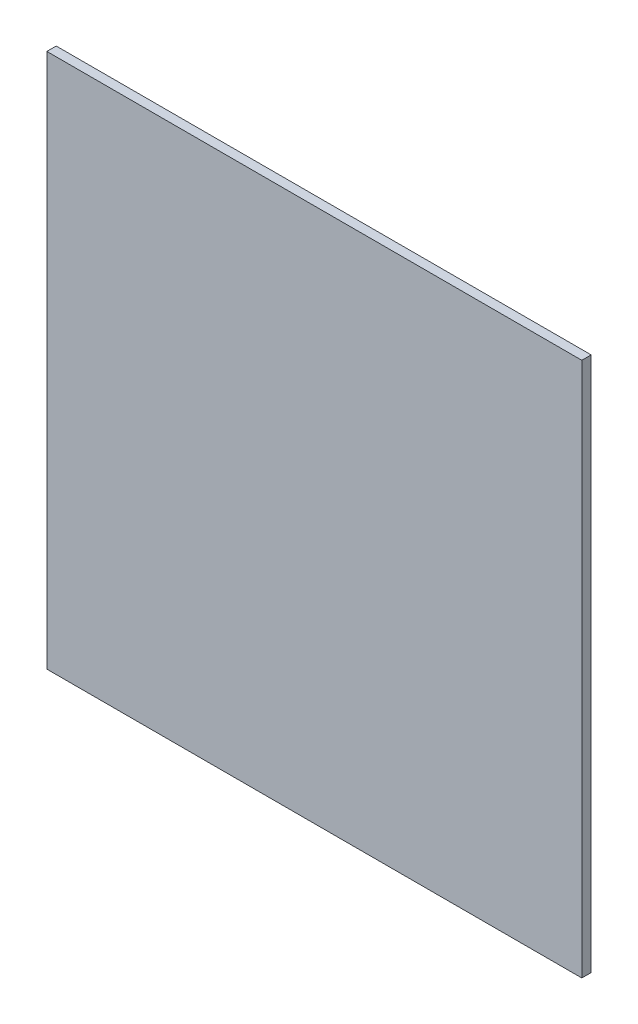
ISO-10303-21;
HEADER;
FILE_DESCRIPTION(('STEP AP214'),'2;1');
FILE_NAME('part.step','',(''),(''),'','','');
FILE_SCHEMA(('AUTOMOTIVE_DESIGN { 1 0 10303 214 1 1 1 1 }'));
ENDSEC;
DATA;
#1=APPLICATION_CONTEXT('core data for automotive mechanical design processes');
#2=APPLICATION_PROTOCOL_DEFINITION('international standard','automotive_design',2000,#1);
#3=PRODUCT_CONTEXT('',#1,'mechanical');
#4=PRODUCT('Part','Part','',(#3));
#5=PRODUCT_RELATED_PRODUCT_CATEGORY('part','',(#4));
#6=PRODUCT_DEFINITION_FORMATION('','',#4);
#7=PRODUCT_DEFINITION_CONTEXT('part definition',#1,'design');
#8=PRODUCT_DEFINITION('design','',#6,#7);
#9=PRODUCT_DEFINITION_SHAPE('','',#8);
#10=(LENGTH_UNIT() NAMED_UNIT(*) SI_UNIT(.MILLI.,.METRE.));
#11=(NAMED_UNIT(*) PLANE_ANGLE_UNIT() SI_UNIT($,.RADIAN.));
#12=(NAMED_UNIT(*) SI_UNIT($,.STERADIAN.) SOLID_ANGLE_UNIT());
#13=UNCERTAINTY_MEASURE_WITH_UNIT(LENGTH_MEASURE(1.E-05),#10,'distance_accuracy_value','');
#14=(GEOMETRIC_REPRESENTATION_CONTEXT(3) GLOBAL_UNCERTAINTY_ASSIGNED_CONTEXT((#13)) GLOBAL_UNIT_ASSIGNED_CONTEXT((#10,
#11,#12)) REPRESENTATION_CONTEXT('',''));
#15=CARTESIAN_POINT('',(0.,0.,0.));
#16=DIRECTION('',(0.,0.,1.));
#17=DIRECTION('',(1.,0.,0.));
#18=AXIS2_PLACEMENT_3D('',#15,#16,#17);
#19=CARTESIAN_POINT('',(120.7,-129.5,1.635));
#20=DIRECTION('',(0.,0.,-1.));
#21=DIRECTION('',(0.,-1.,0.));
#22=AXIS2_PLACEMENT_3D('',#19,#20,#21);
#23=PLANE('',#22);
#24=DIRECTION('',(0.,-1.,0.));
#25=VECTOR('',#24,1.);
#26=CARTESIAN_POINT('',(121.7,-128.5,1.635));
#27=LINE('',#26,#25);
#28=CARTESIAN_POINT('',(121.7,-128.5,1.635));
#29=VERTEX_POINT('',#28);
#30=CARTESIAN_POINT('',(121.7,-130.5,1.635));
#31=VERTEX_POINT('',#30);
#32=EDGE_CURVE('E26',#29,#31,#27,.T.);
#33=ORIENTED_EDGE('',*,*,#32,.F.);
#34=DIRECTION('',(1.,0.,0.));
#35=VECTOR('',#34,1.);
#36=CARTESIAN_POINT('',(119.7,-128.5,1.635));
#37=LINE('',#36,#35);
#38=CARTESIAN_POINT('',(119.7,-128.5,1.635));
#39=VERTEX_POINT('',#38);
#40=EDGE_CURVE('E83',#39,#29,#37,.T.);
#41=ORIENTED_EDGE('',*,*,#40,.F.);
#42=DIRECTION('',(0.,1.,0.));
#43=VECTOR('',#42,1.);
#44=CARTESIAN_POINT('',(119.7,-130.5,1.635));
#45=LINE('',#44,#43);
#46=CARTESIAN_POINT('',(119.7,-130.5,1.635));
#47=VERTEX_POINT('',#46);
#48=EDGE_CURVE('E86',#47,#39,#45,.T.);
#49=ORIENTED_EDGE('',*,*,#48,.F.);
#50=DIRECTION('',(-1.,0.,0.));
#51=VECTOR('',#50,1.);
#52=CARTESIAN_POINT('',(121.7,-130.5,1.635));
#53=LINE('',#52,#51);
#54=EDGE_CURVE('E107',#31,#47,#53,.T.);
#55=ORIENTED_EDGE('',*,*,#54,.F.);
#56=EDGE_LOOP('',(#33,#41,#49,#55));
#57=FACE_BOUND('',#56,.T.);
#58=ADVANCED_FACE('F17',(#57),#23,.F.);
#59=CARTESIAN_POINT('',(120.7,-129.5,1.6));
#60=DIRECTION('',(0.,0.,-1.));
#61=DIRECTION('',(0.,-1.,0.));
#62=AXIS2_PLACEMENT_3D('',#59,#60,#61);
#63=PLANE('',#62);
#64=DIRECTION('',(-1.,0.,0.));
#65=VECTOR('',#64,1.);
#66=CARTESIAN_POINT('',(121.7,-130.5,1.6));
#67=LINE('',#66,#65);
#68=CARTESIAN_POINT('',(121.7,-130.5,1.6));
#69=VERTEX_POINT('',#68);
#70=CARTESIAN_POINT('',(119.7,-130.5,1.6));
#71=VERTEX_POINT('',#70);
#72=EDGE_CURVE('E78',#69,#71,#67,.T.);
#73=ORIENTED_EDGE('',*,*,#72,.T.);
#74=DIRECTION('',(0.,1.,0.));
#75=VECTOR('',#74,1.);
#76=CARTESIAN_POINT('',(119.7,-130.5,1.6));
#77=LINE('',#76,#75);
#78=CARTESIAN_POINT('',(119.7,-128.5,1.6));
#79=VERTEX_POINT('',#78);
#80=EDGE_CURVE('E75',#71,#79,#77,.T.);
#81=ORIENTED_EDGE('',*,*,#80,.T.);
#82=DIRECTION('',(1.,0.,0.));
#83=VECTOR('',#82,1.);
#84=CARTESIAN_POINT('',(119.7,-128.5,1.6));
#85=LINE('',#84,#83);
#86=CARTESIAN_POINT('',(121.7,-128.5,1.6));
#87=VERTEX_POINT('',#86);
#88=EDGE_CURVE('E64',#79,#87,#85,.T.);
#89=ORIENTED_EDGE('',*,*,#88,.T.);
#90=DIRECTION('',(0.,-1.,0.));
#91=VECTOR('',#90,1.);
#92=CARTESIAN_POINT('',(121.7,-128.5,1.6));
#93=LINE('',#92,#91);
#94=EDGE_CURVE('E11',#87,#69,#93,.T.);
#95=ORIENTED_EDGE('',*,*,#94,.T.);
#96=EDGE_LOOP('',(#73,#81,#89,#95));
#97=FACE_BOUND('',#96,.T.);
#98=ADVANCED_FACE('F76',(#97),#63,.T.);
#99=CARTESIAN_POINT('',(121.7,-128.5,1.6));
#100=DIRECTION('',(1.,0.,0.));
#101=DIRECTION('',(0.,1.,0.));
#102=AXIS2_PLACEMENT_3D('',#99,#100,#101);
#103=PLANE('',#102);
#104=DIRECTION('',(0.,0.,1.));
#105=VECTOR('',#104,1.);
#106=CARTESIAN_POINT('',(121.7,-128.5,1.6));
#107=LINE('',#106,#105);
#108=EDGE_CURVE('E71',#87,#29,#107,.T.);
#109=ORIENTED_EDGE('',*,*,#108,.T.);
#110=ORIENTED_EDGE('',*,*,#32,.T.);
#111=DIRECTION('',(0.,0.,1.));
#112=VECTOR('',#111,1.);
#113=CARTESIAN_POINT('',(121.7,-130.5,1.6));
#114=LINE('',#113,#112);
#115=EDGE_CURVE('E112',#69,#31,#114,.T.);
#116=ORIENTED_EDGE('',*,*,#115,.F.);
#117=ORIENTED_EDGE('',*,*,#94,.F.);
#118=EDGE_LOOP('',(#109,#110,#116,#117));
#119=FACE_BOUND('',#118,.T.);
#120=ADVANCED_FACE('F103',(#119),#103,.T.);
#121=CARTESIAN_POINT('',(119.7,-128.5,1.6));
#122=DIRECTION('',(0.,1.,0.));
#123=DIRECTION('',(1.,0.,0.));
#124=AXIS2_PLACEMENT_3D('',#121,#122,#123);
#125=PLANE('',#124);
#126=DIRECTION('',(0.,0.,1.));
#127=VECTOR('',#126,1.);
#128=CARTESIAN_POINT('',(119.7,-128.5,1.6));
#129=LINE('',#128,#127);
#130=EDGE_CURVE('E69',#79,#39,#129,.T.);
#131=ORIENTED_EDGE('',*,*,#130,.T.);
#132=ORIENTED_EDGE('',*,*,#40,.T.);
#133=ORIENTED_EDGE('',*,*,#108,.F.);
#134=ORIENTED_EDGE('',*,*,#88,.F.);
#135=EDGE_LOOP('',(#131,#132,#133,#134));
#136=FACE_BOUND('',#135,.T.);
#137=ADVANCED_FACE('F66',(#136),#125,.T.);
#138=CARTESIAN_POINT('',(119.7,-130.5,1.6));
#139=DIRECTION('',(-1.,0.,0.));
#140=DIRECTION('',(0.,0.,1.));
#141=AXIS2_PLACEMENT_3D('',#138,#139,#140);
#142=PLANE('',#141);
#143=DIRECTION('',(0.,0.,1.));
#144=VECTOR('',#143,1.);
#145=CARTESIAN_POINT('',(119.7,-130.5,1.6));
#146=LINE('',#145,#144);
#147=EDGE_CURVE('E111',#71,#47,#146,.T.);
#148=ORIENTED_EDGE('',*,*,#147,.T.);
#149=ORIENTED_EDGE('',*,*,#48,.T.);
#150=ORIENTED_EDGE('',*,*,#130,.F.);
#151=ORIENTED_EDGE('',*,*,#80,.F.);
#152=EDGE_LOOP('',(#148,#149,#150,#151));
#153=FACE_BOUND('',#152,.T.);
#154=ADVANCED_FACE('F85',(#153),#142,.T.);
#155=CARTESIAN_POINT('',(121.7,-130.5,1.6));
#156=DIRECTION('',(0.,-1.,0.));
#157=DIRECTION('',(0.,0.,-1.));
#158=AXIS2_PLACEMENT_3D('',#155,#156,#157);
#159=PLANE('',#158);
#160=ORIENTED_EDGE('',*,*,#115,.T.);
#161=ORIENTED_EDGE('',*,*,#54,.T.);
#162=ORIENTED_EDGE('',*,*,#147,.F.);
#163=ORIENTED_EDGE('',*,*,#72,.F.);
#164=EDGE_LOOP('',(#160,#161,#162,#163));
#165=FACE_BOUND('',#164,.T.);
#166=ADVANCED_FACE('F114',(#165),#159,.T.);
#167=CLOSED_SHELL('',(#58,#98,#120,#137,#154,#166));
#168=MANIFOLD_SOLID_BREP('B1',#167);
#169=ADVANCED_BREP_SHAPE_REPRESENTATION('',(#18,#168),#14);
#170=SHAPE_DEFINITION_REPRESENTATION(#9,#169);
ENDSEC;
END-ISO-10303-21;
